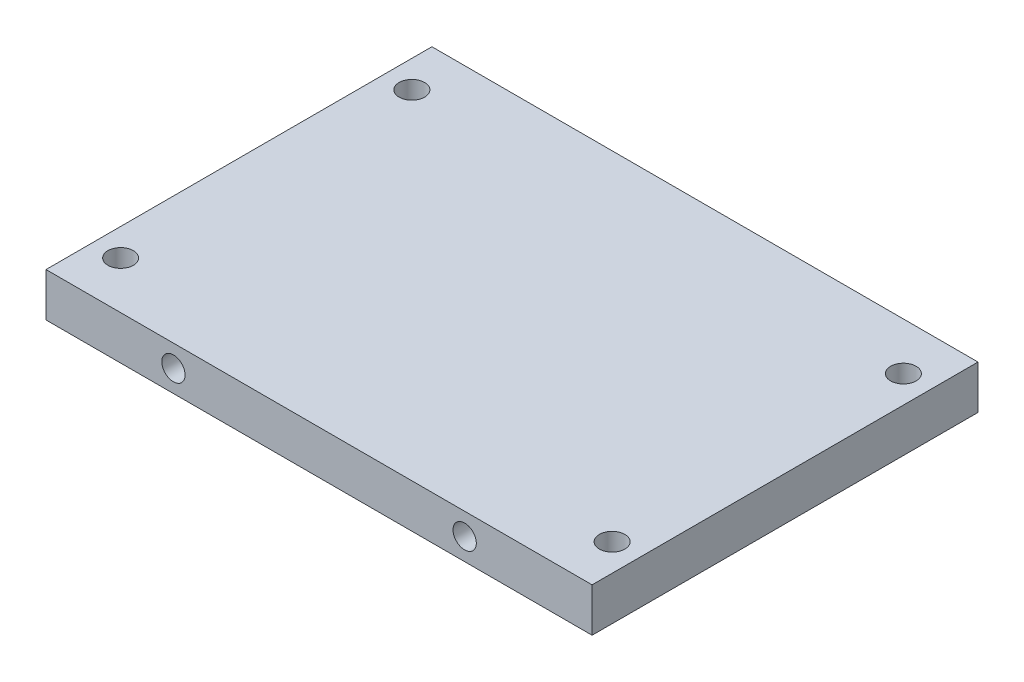
ISO-10303-21;
HEADER;
FILE_DESCRIPTION(('STEP AP214'),'2;1');
FILE_NAME('part.step','',(''),(''),'','','');
FILE_SCHEMA(('AUTOMOTIVE_DESIGN { 1 0 10303 214 1 1 1 1 }'));
ENDSEC;
DATA;
#1=APPLICATION_CONTEXT('core data for automotive mechanical design processes');
#2=APPLICATION_PROTOCOL_DEFINITION('international standard','automotive_design',2000,#1);
#3=PRODUCT_CONTEXT('',#1,'mechanical');
#4=PRODUCT('Part','Part','',(#3));
#5=PRODUCT_RELATED_PRODUCT_CATEGORY('part','',(#4));
#6=PRODUCT_DEFINITION_FORMATION('','',#4);
#7=PRODUCT_DEFINITION_CONTEXT('part definition',#1,'design');
#8=PRODUCT_DEFINITION('design','',#6,#7);
#9=PRODUCT_DEFINITION_SHAPE('','',#8);
#10=(LENGTH_UNIT() NAMED_UNIT(*) SI_UNIT(.MILLI.,.METRE.));
#11=(NAMED_UNIT(*) PLANE_ANGLE_UNIT() SI_UNIT($,.RADIAN.));
#12=(NAMED_UNIT(*) SI_UNIT($,.STERADIAN.) SOLID_ANGLE_UNIT());
#13=UNCERTAINTY_MEASURE_WITH_UNIT(LENGTH_MEASURE(1.E-05),#10,'distance_accuracy_value','');
#14=(GEOMETRIC_REPRESENTATION_CONTEXT(3) GLOBAL_UNCERTAINTY_ASSIGNED_CONTEXT((#13)) GLOBAL_UNIT_ASSIGNED_CONTEXT((#10,
#11,#12)) REPRESENTATION_CONTEXT('',''));
#15=CARTESIAN_POINT('',(0.,0.,0.));
#16=DIRECTION('',(0.,0.,1.));
#17=DIRECTION('',(1.,0.,0.));
#18=AXIS2_PLACEMENT_3D('',#15,#16,#17);
#19=CARTESIAN_POINT('',(0.,6.,0.));
#20=DIRECTION('',(1.,0.,0.));
#21=DIRECTION('',(0.,0.,-1.));
#22=AXIS2_PLACEMENT_3D('',#19,#20,#21);
#23=PLANE('',#22);
#24=DIRECTION('',(0.,0.,1.));
#25=VECTOR('',#24,1.);
#26=CARTESIAN_POINT('',(0.,0.,0.));
#27=LINE('',#26,#25);
#28=CARTESIAN_POINT('',(0.,0.,0.));
#29=VERTEX_POINT('',#28);
#30=CARTESIAN_POINT('',(0.,0.,53.));
#31=VERTEX_POINT('',#30);
#32=EDGE_CURVE('E128',#29,#31,#27,.T.);
#33=ORIENTED_EDGE('',*,*,#32,.T.);
#34=DIRECTION('',(0.,-1.,0.));
#35=VECTOR('',#34,1.);
#36=CARTESIAN_POINT('',(0.,6.,53.));
#37=LINE('',#36,#35);
#38=CARTESIAN_POINT('',(0.,6.,53.));
#39=VERTEX_POINT('',#38);
#40=EDGE_CURVE('E11',#39,#31,#37,.T.);
#41=ORIENTED_EDGE('',*,*,#40,.F.);
#42=DIRECTION('',(0.,0.,1.));
#43=VECTOR('',#42,1.);
#44=CARTESIAN_POINT('',(0.,6.,0.));
#45=LINE('',#44,#43);
#46=CARTESIAN_POINT('',(0.,6.,0.));
#47=VERTEX_POINT('',#46);
#48=EDGE_CURVE('E93',#47,#39,#45,.T.);
#49=ORIENTED_EDGE('',*,*,#48,.F.);
#50=DIRECTION('',(0.,-1.,0.));
#51=VECTOR('',#50,1.);
#52=CARTESIAN_POINT('',(0.,6.,0.));
#53=LINE('',#52,#51);
#54=EDGE_CURVE('E59',#47,#29,#53,.T.);
#55=ORIENTED_EDGE('',*,*,#54,.T.);
#56=EDGE_LOOP('',(#33,#41,#49,#55));
#57=FACE_BOUND('',#56,.T.);
#58=ADVANCED_FACE('F41',(#57),#23,.F.);
#59=CARTESIAN_POINT('',(0.,6.,53.));
#60=DIRECTION('',(0.,0.,-1.));
#61=DIRECTION('',(-1.,0.,0.));
#62=AXIS2_PLACEMENT_3D('',#59,#60,#61);
#63=PLANE('',#62);
#64=CARTESIAN_POINT('',(17.5,3.,53.));
#65=DIRECTION('',(0.,0.,1.));
#66=DIRECTION('',(1.,0.,0.));
#67=AXIS2_PLACEMENT_3D('',#64,#65,#66);
#68=CIRCLE('',#67,1.6);
#69=CARTESIAN_POINT('',(19.1,3.,53.));
#70=VERTEX_POINT('',#69);
#71=EDGE_CURVE('E238',#70,#70,#68,.T.);
#72=ORIENTED_EDGE('',*,*,#71,.F.);
#73=EDGE_LOOP('',(#72));
#74=FACE_BOUND('',#73,.T.);
#75=CARTESIAN_POINT('',(57.5,3.,53.));
#76=DIRECTION('',(0.,0.,1.));
#77=DIRECTION('',(1.,0.,0.));
#78=AXIS2_PLACEMENT_3D('',#75,#76,#77);
#79=CIRCLE('',#78,1.6);
#80=CARTESIAN_POINT('',(59.1,3.,53.));
#81=VERTEX_POINT('',#80);
#82=EDGE_CURVE('E161',#81,#81,#79,.T.);
#83=ORIENTED_EDGE('',*,*,#82,.F.);
#84=EDGE_LOOP('',(#83));
#85=FACE_BOUND('',#84,.T.);
#86=DIRECTION('',(1.,0.,0.));
#87=VECTOR('',#86,1.);
#88=CARTESIAN_POINT('',(0.,0.,53.));
#89=LINE('',#88,#87);
#90=CARTESIAN_POINT('',(75.,0.,53.));
#91=VERTEX_POINT('',#90);
#92=EDGE_CURVE('E99',#31,#91,#89,.T.);
#93=ORIENTED_EDGE('',*,*,#92,.T.);
#94=DIRECTION('',(0.,-1.,0.));
#95=VECTOR('',#94,1.);
#96=CARTESIAN_POINT('',(75.,6.,53.));
#97=LINE('',#96,#95);
#98=CARTESIAN_POINT('',(75.,6.,53.));
#99=VERTEX_POINT('',#98);
#100=EDGE_CURVE('E51',#99,#91,#97,.T.);
#101=ORIENTED_EDGE('',*,*,#100,.F.);
#102=DIRECTION('',(1.,0.,0.));
#103=VECTOR('',#102,1.);
#104=CARTESIAN_POINT('',(0.,6.,53.));
#105=LINE('',#104,#103);
#106=EDGE_CURVE('E84',#39,#99,#105,.T.);
#107=ORIENTED_EDGE('',*,*,#106,.F.);
#108=ORIENTED_EDGE('',*,*,#40,.T.);
#109=EDGE_LOOP('',(#93,#101,#107,#108));
#110=FACE_BOUND('',#109,.T.);
#111=ADVANCED_FACE('F98',(#74,#85,#110),#63,.F.);
#112=CARTESIAN_POINT('',(75.,6.,0.));
#113=DIRECTION('',(1.,0.,0.));
#114=DIRECTION('',(0.,0.,-1.));
#115=AXIS2_PLACEMENT_3D('',#112,#113,#114);
#116=PLANE('',#115);
#117=DIRECTION('',(0.,0.,1.));
#118=VECTOR('',#117,1.);
#119=CARTESIAN_POINT('',(75.,0.,0.));
#120=LINE('',#119,#118);
#121=CARTESIAN_POINT('',(75.,0.,0.));
#122=VERTEX_POINT('',#121);
#123=EDGE_CURVE('E133',#122,#91,#120,.T.);
#124=ORIENTED_EDGE('',*,*,#123,.F.);
#125=DIRECTION('',(0.,-1.,0.));
#126=VECTOR('',#125,1.);
#127=CARTESIAN_POINT('',(75.,6.,0.));
#128=LINE('',#127,#126);
#129=CARTESIAN_POINT('',(75.,6.,0.));
#130=VERTEX_POINT('',#129);
#131=EDGE_CURVE('E73',#130,#122,#128,.T.);
#132=ORIENTED_EDGE('',*,*,#131,.F.);
#133=DIRECTION('',(0.,0.,1.));
#134=VECTOR('',#133,1.);
#135=CARTESIAN_POINT('',(75.,6.,0.));
#136=LINE('',#135,#134);
#137=EDGE_CURVE('E92',#130,#99,#136,.T.);
#138=ORIENTED_EDGE('',*,*,#137,.T.);
#139=ORIENTED_EDGE('',*,*,#100,.T.);
#140=EDGE_LOOP('',(#124,#132,#138,#139));
#141=FACE_BOUND('',#140,.T.);
#142=ADVANCED_FACE('F103',(#141),#116,.T.);
#143=CARTESIAN_POINT('',(0.,6.,0.));
#144=DIRECTION('',(0.,0.,-1.));
#145=DIRECTION('',(-1.,0.,0.));
#146=AXIS2_PLACEMENT_3D('',#143,#144,#145);
#147=PLANE('',#146);
#148=CARTESIAN_POINT('',(17.5,3.,0.));
#149=DIRECTION('',(0.,0.,-1.));
#150=DIRECTION('',(-1.,0.,0.));
#151=AXIS2_PLACEMENT_3D('',#148,#149,#150);
#152=CIRCLE('',#151,1.6);
#153=CARTESIAN_POINT('',(15.9,3.,0.));
#154=VERTEX_POINT('',#153);
#155=EDGE_CURVE('E222',#154,#154,#152,.T.);
#156=ORIENTED_EDGE('',*,*,#155,.F.);
#157=EDGE_LOOP('',(#156));
#158=FACE_BOUND('',#157,.T.);
#159=CARTESIAN_POINT('',(57.5,3.,0.));
#160=DIRECTION('',(0.,0.,-1.));
#161=DIRECTION('',(-1.,0.,0.));
#162=AXIS2_PLACEMENT_3D('',#159,#160,#161);
#163=CIRCLE('',#162,1.6);
#164=CARTESIAN_POINT('',(55.9,3.,0.));
#165=VERTEX_POINT('',#164);
#166=EDGE_CURVE('E225',#165,#165,#163,.T.);
#167=ORIENTED_EDGE('',*,*,#166,.F.);
#168=EDGE_LOOP('',(#167));
#169=FACE_BOUND('',#168,.T.);
#170=DIRECTION('',(1.,0.,0.));
#171=VECTOR('',#170,1.);
#172=CARTESIAN_POINT('',(0.,0.,0.));
#173=LINE('',#172,#171);
#174=EDGE_CURVE('E136',#29,#122,#173,.T.);
#175=ORIENTED_EDGE('',*,*,#174,.F.);
#176=ORIENTED_EDGE('',*,*,#54,.F.);
#177=DIRECTION('',(1.,0.,0.));
#178=VECTOR('',#177,1.);
#179=CARTESIAN_POINT('',(0.,6.,0.));
#180=LINE('',#179,#178);
#181=EDGE_CURVE('E105',#47,#130,#180,.T.);
#182=ORIENTED_EDGE('',*,*,#181,.T.);
#183=ORIENTED_EDGE('',*,*,#131,.T.);
#184=EDGE_LOOP('',(#175,#176,#182,#183));
#185=FACE_BOUND('',#184,.T.);
#186=ADVANCED_FACE('F199',(#158,#169,#185),#147,.T.);
#187=CARTESIAN_POINT('',(71.25,6.,6.49999999999999));
#188=DIRECTION('',(0.,-1.,0.));
#189=DIRECTION('',(0.,0.,-1.));
#190=AXIS2_PLACEMENT_3D('',#187,#188,#189);
#191=CYLINDRICAL_SURFACE('',#190,1.75);
#192=CARTESIAN_POINT('',(71.25,6.,6.49999999999999));
#193=DIRECTION('',(0.,1.,0.));
#194=DIRECTION('',(0.,0.,1.));
#195=AXIS2_PLACEMENT_3D('',#192,#193,#194);
#196=CIRCLE('',#195,1.75);
#197=CARTESIAN_POINT('',(71.25,6.,8.24999999999999));
#198=VERTEX_POINT('',#197);
#199=EDGE_CURVE('E158',#198,#198,#196,.T.);
#200=ORIENTED_EDGE('',*,*,#199,.T.);
#201=EDGE_LOOP('',(#200));
#202=FACE_BOUND('',#201,.T.);
#203=CARTESIAN_POINT('',(71.25,0.,6.49999999999999));
#204=DIRECTION('',(0.,1.,0.));
#205=DIRECTION('',(0.,0.,1.));
#206=AXIS2_PLACEMENT_3D('',#203,#204,#205);
#207=CIRCLE('',#206,1.75);
#208=CARTESIAN_POINT('',(71.25,0.,8.24999999999999));
#209=VERTEX_POINT('',#208);
#210=EDGE_CURVE('E124',#209,#209,#207,.T.);
#211=ORIENTED_EDGE('',*,*,#210,.F.);
#212=EDGE_LOOP('',(#211));
#213=FACE_BOUND('',#212,.T.);
#214=ADVANCED_FACE('F169',(#202,#213),#191,.F.);
#215=CARTESIAN_POINT('',(3.75,6.,6.49999999999999));
#216=DIRECTION('',(0.,-1.,0.));
#217=DIRECTION('',(0.,0.,-1.));
#218=AXIS2_PLACEMENT_3D('',#215,#216,#217);
#219=CYLINDRICAL_SURFACE('',#218,1.75);
#220=CARTESIAN_POINT('',(3.75,6.,6.49999999999999));
#221=DIRECTION('',(0.,1.,0.));
#222=DIRECTION('',(0.,0.,1.));
#223=AXIS2_PLACEMENT_3D('',#220,#221,#222);
#224=CIRCLE('',#223,1.75);
#225=CARTESIAN_POINT('',(3.75,6.,8.24999999999999));
#226=VERTEX_POINT('',#225);
#227=EDGE_CURVE('E152',#226,#226,#224,.F.);
#228=ORIENTED_EDGE('',*,*,#227,.F.);
#229=EDGE_LOOP('',(#228));
#230=FACE_BOUND('',#229,.T.);
#231=CARTESIAN_POINT('',(3.75,0.,6.49999999999999));
#232=DIRECTION('',(0.,1.,0.));
#233=DIRECTION('',(0.,0.,1.));
#234=AXIS2_PLACEMENT_3D('',#231,#232,#233);
#235=CIRCLE('',#234,1.75);
#236=CARTESIAN_POINT('',(3.75,0.,8.24999999999999));
#237=VERTEX_POINT('',#236);
#238=EDGE_CURVE('E119',#237,#237,#235,.F.);
#239=ORIENTED_EDGE('',*,*,#238,.T.);
#240=EDGE_LOOP('',(#239));
#241=FACE_BOUND('',#240,.T.);
#242=ADVANCED_FACE('F198',(#230,#241),#219,.F.);
#243=CARTESIAN_POINT('',(3.75,6.,46.5));
#244=DIRECTION('',(0.,-1.,0.));
#245=DIRECTION('',(0.,0.,-1.));
#246=AXIS2_PLACEMENT_3D('',#243,#244,#245);
#247=CYLINDRICAL_SURFACE('',#246,1.75);
#248=CARTESIAN_POINT('',(3.75,6.,46.5));
#249=DIRECTION('',(0.,1.,0.));
#250=DIRECTION('',(0.,0.,1.));
#251=AXIS2_PLACEMENT_3D('',#248,#249,#250);
#252=CIRCLE('',#251,1.75);
#253=CARTESIAN_POINT('',(3.75,6.,48.25));
#254=VERTEX_POINT('',#253);
#255=EDGE_CURVE('E144',#254,#254,#252,.T.);
#256=ORIENTED_EDGE('',*,*,#255,.T.);
#257=EDGE_LOOP('',(#256));
#258=FACE_BOUND('',#257,.T.);
#259=CARTESIAN_POINT('',(3.75,0.,46.5));
#260=DIRECTION('',(0.,1.,0.));
#261=DIRECTION('',(0.,0.,1.));
#262=AXIS2_PLACEMENT_3D('',#259,#260,#261);
#263=CIRCLE('',#262,1.75);
#264=CARTESIAN_POINT('',(3.75,0.,48.25));
#265=VERTEX_POINT('',#264);
#266=EDGE_CURVE('E115',#265,#265,#263,.T.);
#267=ORIENTED_EDGE('',*,*,#266,.F.);
#268=EDGE_LOOP('',(#267));
#269=FACE_BOUND('',#268,.T.);
#270=ADVANCED_FACE('F43',(#258,#269),#247,.F.);
#271=CARTESIAN_POINT('',(71.25,6.,46.5));
#272=DIRECTION('',(0.,-1.,0.));
#273=DIRECTION('',(0.,0.,-1.));
#274=AXIS2_PLACEMENT_3D('',#271,#272,#273);
#275=CYLINDRICAL_SURFACE('',#274,1.75);
#276=CARTESIAN_POINT('',(71.25,6.,46.5));
#277=DIRECTION('',(0.,1.,0.));
#278=DIRECTION('',(0.,0.,1.));
#279=AXIS2_PLACEMENT_3D('',#276,#277,#278);
#280=CIRCLE('',#279,1.75);
#281=CARTESIAN_POINT('',(71.25,6.,48.25));
#282=VERTEX_POINT('',#281);
#283=EDGE_CURVE('E108',#282,#282,#280,.F.);
#284=ORIENTED_EDGE('',*,*,#283,.F.);
#285=EDGE_LOOP('',(#284));
#286=FACE_BOUND('',#285,.T.);
#287=CARTESIAN_POINT('',(71.25,0.,46.5));
#288=DIRECTION('',(0.,1.,0.));
#289=DIRECTION('',(0.,0.,1.));
#290=AXIS2_PLACEMENT_3D('',#287,#288,#289);
#291=CIRCLE('',#290,1.75);
#292=CARTESIAN_POINT('',(71.25,0.,48.25));
#293=VERTEX_POINT('',#292);
#294=EDGE_CURVE('E140',#293,#293,#291,.F.);
#295=ORIENTED_EDGE('',*,*,#294,.T.);
#296=EDGE_LOOP('',(#295));
#297=FACE_BOUND('',#296,.T.);
#298=ADVANCED_FACE('F174',(#286,#297),#275,.F.);
#299=CARTESIAN_POINT('',(0.,6.,0.));
#300=DIRECTION('',(0.,1.,0.));
#301=DIRECTION('',(0.,0.,1.));
#302=AXIS2_PLACEMENT_3D('',#299,#300,#301);
#303=PLANE('',#302);
#304=ORIENTED_EDGE('',*,*,#255,.F.);
#305=EDGE_LOOP('',(#304));
#306=FACE_BOUND('',#305,.T.);
#307=ORIENTED_EDGE('',*,*,#227,.T.);
#308=EDGE_LOOP('',(#307));
#309=FACE_BOUND('',#308,.T.);
#310=ORIENTED_EDGE('',*,*,#199,.F.);
#311=EDGE_LOOP('',(#310));
#312=FACE_BOUND('',#311,.T.);
#313=ORIENTED_EDGE('',*,*,#48,.T.);
#314=ORIENTED_EDGE('',*,*,#106,.T.);
#315=ORIENTED_EDGE('',*,*,#137,.F.);
#316=ORIENTED_EDGE('',*,*,#181,.F.);
#317=EDGE_LOOP('',(#313,#314,#315,#316));
#318=FACE_BOUND('',#317,.T.);
#319=ORIENTED_EDGE('',*,*,#283,.T.);
#320=EDGE_LOOP('',(#319));
#321=FACE_BOUND('',#320,.T.);
#322=ADVANCED_FACE('F88',(#306,#309,#312,#318,#321),#303,.T.);
#323=CARTESIAN_POINT('',(0.,0.,0.));
#324=DIRECTION('',(0.,1.,0.));
#325=DIRECTION('',(0.,0.,1.));
#326=AXIS2_PLACEMENT_3D('',#323,#324,#325);
#327=PLANE('',#326);
#328=ORIENTED_EDGE('',*,*,#266,.T.);
#329=EDGE_LOOP('',(#328));
#330=FACE_BOUND('',#329,.T.);
#331=ORIENTED_EDGE('',*,*,#238,.F.);
#332=EDGE_LOOP('',(#331));
#333=FACE_BOUND('',#332,.T.);
#334=ORIENTED_EDGE('',*,*,#210,.T.);
#335=EDGE_LOOP('',(#334));
#336=FACE_BOUND('',#335,.T.);
#337=ORIENTED_EDGE('',*,*,#32,.F.);
#338=ORIENTED_EDGE('',*,*,#174,.T.);
#339=ORIENTED_EDGE('',*,*,#123,.T.);
#340=ORIENTED_EDGE('',*,*,#92,.F.);
#341=EDGE_LOOP('',(#337,#338,#339,#340));
#342=FACE_BOUND('',#341,.T.);
#343=ORIENTED_EDGE('',*,*,#294,.F.);
#344=EDGE_LOOP('',(#343));
#345=FACE_BOUND('',#344,.T.);
#346=ADVANCED_FACE('F173',(#330,#333,#336,#342,#345),#327,.F.);
#347=CARTESIAN_POINT('',(57.5,3.,43.));
#348=DIRECTION('',(0.,0.,1.));
#349=DIRECTION('',(1.,0.,0.));
#350=AXIS2_PLACEMENT_3D('',#347,#348,#349);
#351=CYLINDRICAL_SURFACE('',#350,1.6);
#352=CARTESIAN_POINT('',(57.5,3.,43.));
#353=DIRECTION('',(0.,0.,1.));
#354=DIRECTION('',(1.,0.,0.));
#355=AXIS2_PLACEMENT_3D('',#352,#353,#354);
#356=CIRCLE('',#355,1.6);
#357=CARTESIAN_POINT('',(59.1,3.,43.));
#358=VERTEX_POINT('',#357);
#359=EDGE_CURVE('E241',#358,#358,#356,.T.);
#360=ORIENTED_EDGE('',*,*,#359,.F.);
#361=EDGE_LOOP('',(#360));
#362=FACE_BOUND('',#361,.T.);
#363=ORIENTED_EDGE('',*,*,#82,.T.);
#364=EDGE_LOOP('',(#363));
#365=FACE_BOUND('',#364,.T.);
#366=ADVANCED_FACE('F181',(#362,#365),#351,.F.);
#367=CARTESIAN_POINT('',(0.,0.,43.));
#368=DIRECTION('',(0.,0.,1.));
#369=DIRECTION('',(1.,0.,0.));
#370=AXIS2_PLACEMENT_3D('',#367,#368,#369);
#371=PLANE('',#370);
#372=ORIENTED_EDGE('',*,*,#359,.T.);
#373=EDGE_LOOP('',(#372));
#374=FACE_BOUND('',#373,.T.);
#375=ADVANCED_FACE('F283',(#374),#371,.T.);
#376=CARTESIAN_POINT('',(17.5,3.,43.));
#377=DIRECTION('',(0.,0.,1.));
#378=DIRECTION('',(1.,0.,0.));
#379=AXIS2_PLACEMENT_3D('',#376,#377,#378);
#380=CYLINDRICAL_SURFACE('',#379,1.6);
#381=CARTESIAN_POINT('',(17.5,3.,43.));
#382=DIRECTION('',(0.,0.,1.));
#383=DIRECTION('',(1.,0.,0.));
#384=AXIS2_PLACEMENT_3D('',#381,#382,#383);
#385=CIRCLE('',#384,1.6);
#386=CARTESIAN_POINT('',(19.1,3.,43.));
#387=VERTEX_POINT('',#386);
#388=EDGE_CURVE('E120',#387,#387,#385,.T.);
#389=ORIENTED_EDGE('',*,*,#388,.F.);
#390=EDGE_LOOP('',(#389));
#391=FACE_BOUND('',#390,.T.);
#392=ORIENTED_EDGE('',*,*,#71,.T.);
#393=EDGE_LOOP('',(#392));
#394=FACE_BOUND('',#393,.T.);
#395=ADVANCED_FACE('F279',(#391,#394),#380,.F.);
#396=CARTESIAN_POINT('',(0.,0.,43.));
#397=DIRECTION('',(0.,0.,1.));
#398=DIRECTION('',(1.,0.,0.));
#399=AXIS2_PLACEMENT_3D('',#396,#397,#398);
#400=PLANE('',#399);
#401=ORIENTED_EDGE('',*,*,#388,.T.);
#402=EDGE_LOOP('',(#401));
#403=FACE_BOUND('',#402,.T.);
#404=ADVANCED_FACE('F275',(#403),#400,.T.);
#405=CARTESIAN_POINT('',(57.5,3.,10.));
#406=DIRECTION('',(0.,0.,-1.));
#407=DIRECTION('',(-1.,0.,0.));
#408=AXIS2_PLACEMENT_3D('',#405,#406,#407);
#409=CYLINDRICAL_SURFACE('',#408,1.6);
#410=CARTESIAN_POINT('',(57.5,3.,10.));
#411=DIRECTION('',(0.,0.,-1.));
#412=DIRECTION('',(-1.,0.,0.));
#413=AXIS2_PLACEMENT_3D('',#410,#411,#412);
#414=CIRCLE('',#413,1.6);
#415=CARTESIAN_POINT('',(55.9,3.,10.));
#416=VERTEX_POINT('',#415);
#417=EDGE_CURVE('E228',#416,#416,#414,.T.);
#418=ORIENTED_EDGE('',*,*,#417,.F.);
#419=EDGE_LOOP('',(#418));
#420=FACE_BOUND('',#419,.T.);
#421=ORIENTED_EDGE('',*,*,#166,.T.);
#422=EDGE_LOOP('',(#421));
#423=FACE_BOUND('',#422,.T.);
#424=ADVANCED_FACE('F269',(#420,#423),#409,.F.);
#425=CARTESIAN_POINT('',(57.5,3.,10.));
#426=DIRECTION('',(0.,0.,-1.));
#427=DIRECTION('',(-1.,0.,0.));
#428=AXIS2_PLACEMENT_3D('',#425,#426,#427);
#429=PLANE('',#428);
#430=ORIENTED_EDGE('',*,*,#417,.T.);
#431=EDGE_LOOP('',(#430));
#432=FACE_BOUND('',#431,.T.);
#433=ADVANCED_FACE('F261',(#432),#429,.T.);
#434=CARTESIAN_POINT('',(17.5,3.,10.));
#435=DIRECTION('',(0.,0.,-1.));
#436=DIRECTION('',(-1.,0.,0.));
#437=AXIS2_PLACEMENT_3D('',#434,#435,#436);
#438=CYLINDRICAL_SURFACE('',#437,1.6);
#439=CARTESIAN_POINT('',(17.5,3.,10.));
#440=DIRECTION('',(0.,0.,-1.));
#441=DIRECTION('',(-1.,0.,0.));
#442=AXIS2_PLACEMENT_3D('',#439,#440,#441);
#443=CIRCLE('',#442,1.6);
#444=CARTESIAN_POINT('',(15.9,3.,10.));
#445=VERTEX_POINT('',#444);
#446=EDGE_CURVE('E248',#445,#445,#443,.T.);
#447=ORIENTED_EDGE('',*,*,#446,.F.);
#448=EDGE_LOOP('',(#447));
#449=FACE_BOUND('',#448,.T.);
#450=ORIENTED_EDGE('',*,*,#155,.T.);
#451=EDGE_LOOP('',(#450));
#452=FACE_BOUND('',#451,.T.);
#453=ADVANCED_FACE('F258',(#449,#452),#438,.F.);
#454=CARTESIAN_POINT('',(17.5,3.,10.));
#455=DIRECTION('',(0.,0.,-1.));
#456=DIRECTION('',(-1.,0.,0.));
#457=AXIS2_PLACEMENT_3D('',#454,#455,#456);
#458=PLANE('',#457);
#459=ORIENTED_EDGE('',*,*,#446,.T.);
#460=EDGE_LOOP('',(#459));
#461=FACE_BOUND('',#460,.T.);
#462=ADVANCED_FACE('F260',(#461),#458,.T.);
#463=CLOSED_SHELL('',(#58,#111,#142,#186,#214,#242,#270,#298,#322,#346,#366,#375,#395,#404,#424,
#433,#453,#462));
#464=MANIFOLD_SOLID_BREP('B2',#463);
#465=ADVANCED_BREP_SHAPE_REPRESENTATION('',(#18,#464),#14);
#466=SHAPE_DEFINITION_REPRESENTATION(#9,#465);
ENDSEC;
END-ISO-10303-21;
